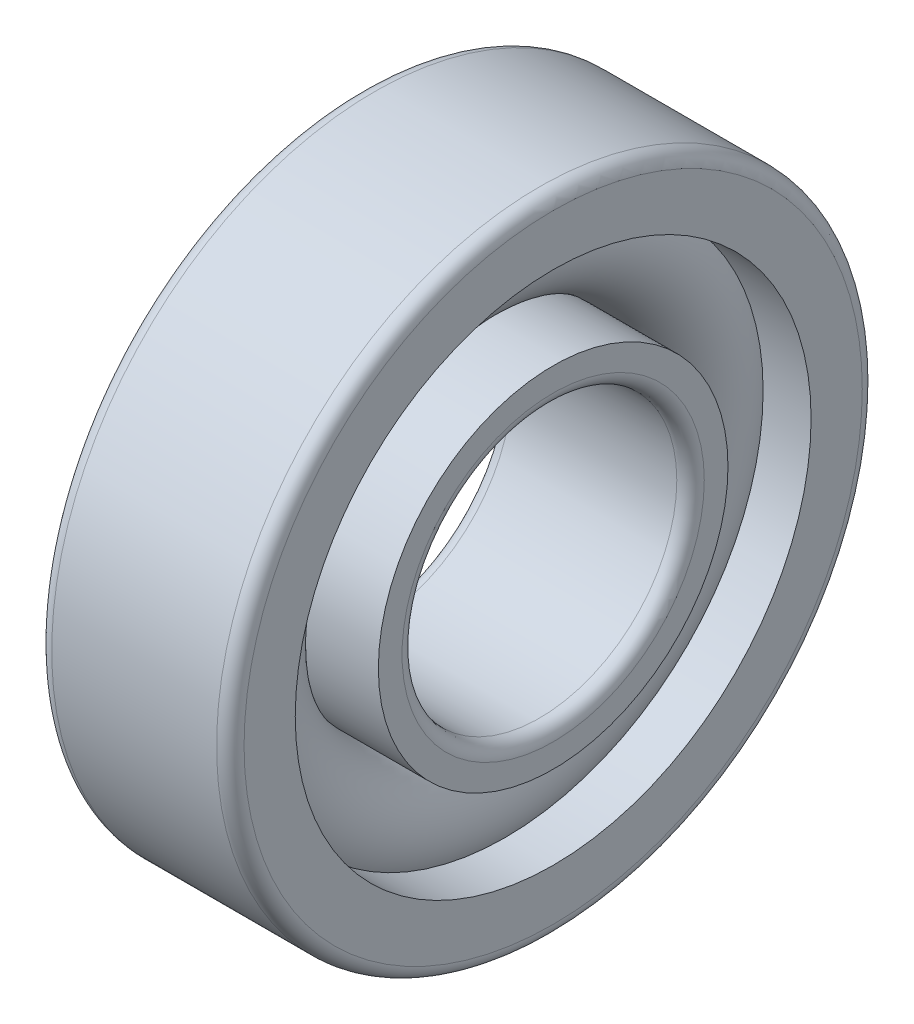
ISO-10303-21;
HEADER;
FILE_DESCRIPTION(('STEP AP214'),'2;1');
FILE_NAME('part.step','',(''),(''),'','','');
FILE_SCHEMA(('AUTOMOTIVE_DESIGN { 1 0 10303 214 1 1 1 1 }'));
ENDSEC;
DATA;
#1=APPLICATION_CONTEXT('core data for automotive mechanical design processes');
#2=APPLICATION_PROTOCOL_DEFINITION('international standard','automotive_design',2000,#1);
#3=PRODUCT_CONTEXT('',#1,'mechanical');
#4=PRODUCT('Part','Part','',(#3));
#5=PRODUCT_RELATED_PRODUCT_CATEGORY('part','',(#4));
#6=PRODUCT_DEFINITION_FORMATION('','',#4);
#7=PRODUCT_DEFINITION_CONTEXT('part definition',#1,'design');
#8=PRODUCT_DEFINITION('design','',#6,#7);
#9=PRODUCT_DEFINITION_SHAPE('','',#8);
#10=(LENGTH_UNIT() NAMED_UNIT(*) SI_UNIT(.MILLI.,.METRE.));
#11=(NAMED_UNIT(*) PLANE_ANGLE_UNIT() SI_UNIT($,.RADIAN.));
#12=(NAMED_UNIT(*) SI_UNIT($,.STERADIAN.) SOLID_ANGLE_UNIT());
#13=UNCERTAINTY_MEASURE_WITH_UNIT(LENGTH_MEASURE(1.E-05),#10,'distance_accuracy_value','');
#14=(GEOMETRIC_REPRESENTATION_CONTEXT(3) GLOBAL_UNCERTAINTY_ASSIGNED_CONTEXT((#13)) GLOBAL_UNIT_ASSIGNED_CONTEXT((#10,
#11,#12)) REPRESENTATION_CONTEXT('',''));
#15=CARTESIAN_POINT('',(0.,0.,0.));
#16=DIRECTION('',(0.,0.,1.));
#17=DIRECTION('',(1.,0.,0.));
#18=AXIS2_PLACEMENT_3D('',#15,#16,#17);
#19=CARTESIAN_POINT('',(0.,0.,0.));
#20=DIRECTION('',(-1.,0.,0.));
#21=DIRECTION('',(0.,0.,1.));
#22=AXIS2_PLACEMENT_3D('',#19,#20,#21);
#23=TOROIDAL_SURFACE('',#22,16.75,4.05);
#24=CARTESIAN_POINT('',(3.50740288532698,0.,0.));
#25=DIRECTION('',(-1.,0.,0.));
#26=DIRECTION('',(0.,0.,1.));
#27=AXIS2_PLACEMENT_3D('',#24,#25,#26);
#28=CIRCLE('',#27,18.775);
#29=CARTESIAN_POINT('',(3.50740288532698,0.,18.775));
#30=VERTEX_POINT('',#29);
#31=EDGE_CURVE('E35',#30,#30,#28,.F.);
#32=ORIENTED_EDGE('',*,*,#31,.T.);
#33=EDGE_LOOP('',(#32));
#34=FACE_BOUND('',#33,.T.);
#35=CARTESIAN_POINT('',(0.449305018890313,0.,0.));
#36=DIRECTION('',(-1.,0.,0.));
#37=DIRECTION('',(0.,0.,1.));
#38=AXIS2_PLACEMENT_3D('',#35,#36,#37);
#39=CIRCLE('',#38,12.725);
#40=CARTESIAN_POINT('',(0.449305018890313,0.,12.725));
#41=VERTEX_POINT('',#40);
#42=EDGE_CURVE('E10',#41,#41,#39,.T.);
#43=ORIENTED_EDGE('',*,*,#42,.T.);
#44=EDGE_LOOP('',(#43));
#45=FACE_BOUND('',#44,.T.);
#46=ADVANCED_FACE('F31',(#34,#45),#23,.T.);
#47=CARTESIAN_POINT('',(-20.6375,0.,0.));
#48=DIRECTION('',(1.,0.,0.));
#49=DIRECTION('',(0.,0.,-1.));
#50=AXIS2_PLACEMENT_3D('',#47,#48,#49);
#51=CYLINDRICAL_SURFACE('',#50,12.725);
#52=CARTESIAN_POINT('',(7.,0.,0.));
#53=DIRECTION('',(1.,0.,0.));
#54=DIRECTION('',(0.,0.,-1.));
#55=AXIS2_PLACEMENT_3D('',#52,#53,#54);
#56=CIRCLE('',#55,12.725);
#57=CARTESIAN_POINT('',(7.,0.,-12.725));
#58=VERTEX_POINT('',#57);
#59=EDGE_CURVE('E44',#58,#58,#56,.T.);
#60=ORIENTED_EDGE('',*,*,#59,.F.);
#61=EDGE_LOOP('',(#60));
#62=FACE_BOUND('',#61,.T.);
#63=ORIENTED_EDGE('',*,*,#42,.F.);
#64=EDGE_LOOP('',(#63));
#65=FACE_BOUND('',#64,.T.);
#66=ADVANCED_FACE('F83',(#62,#65),#51,.T.);
#67=CARTESIAN_POINT('',(-20.6375,0.,0.));
#68=DIRECTION('',(1.,0.,0.));
#69=DIRECTION('',(0.,0.,-1.));
#70=AXIS2_PLACEMENT_3D('',#67,#68,#69);
#71=CYLINDRICAL_SURFACE('',#70,14.725);
#72=CARTESIAN_POINT('',(-7.,0.,0.));
#73=DIRECTION('',(1.,0.,0.));
#74=DIRECTION('',(0.,0.,-1.));
#75=AXIS2_PLACEMENT_3D('',#72,#73,#74);
#76=CIRCLE('',#75,14.725);
#77=CARTESIAN_POINT('',(-7.,0.,-14.725));
#78=VERTEX_POINT('',#77);
#79=EDGE_CURVE('E53',#78,#78,#76,.T.);
#80=ORIENTED_EDGE('',*,*,#79,.T.);
#81=EDGE_LOOP('',(#80));
#82=FACE_BOUND('',#81,.T.);
#83=CARTESIAN_POINT('',(-3.50740288532698,0.,0.));
#84=DIRECTION('',(1.,0.,0.));
#85=DIRECTION('',(0.,0.,-1.));
#86=AXIS2_PLACEMENT_3D('',#83,#84,#85);
#87=CIRCLE('',#86,14.725);
#88=CARTESIAN_POINT('',(-3.50740288532698,0.,-14.725));
#89=VERTEX_POINT('',#88);
#90=EDGE_CURVE('E39',#89,#89,#87,.T.);
#91=ORIENTED_EDGE('',*,*,#90,.F.);
#92=EDGE_LOOP('',(#91));
#93=FACE_BOUND('',#92,.T.);
#94=ADVANCED_FACE('F86',(#82,#93),#71,.T.);
#95=CARTESIAN_POINT('',(7.,11.,0.));
#96=DIRECTION('',(1.,0.,0.));
#97=DIRECTION('',(0.,0.,-1.));
#98=AXIS2_PLACEMENT_3D('',#95,#96,#97);
#99=PLANE('',#98);
#100=ORIENTED_EDGE('',*,*,#59,.T.);
#101=EDGE_LOOP('',(#100));
#102=FACE_BOUND('',#101,.T.);
#103=CARTESIAN_POINT('',(7.,0.,0.));
#104=DIRECTION('',(1.,0.,0.));
#105=DIRECTION('',(0.,0.,-1.));
#106=AXIS2_PLACEMENT_3D('',#103,#104,#105);
#107=CIRCLE('',#106,11.);
#108=CARTESIAN_POINT('',(7.,0.,-11.));
#109=VERTEX_POINT('',#108);
#110=EDGE_CURVE('E75',#109,#109,#107,.T.);
#111=ORIENTED_EDGE('',*,*,#110,.F.);
#112=EDGE_LOOP('',(#111));
#113=FACE_BOUND('',#112,.T.);
#114=ADVANCED_FACE('F80',(#102,#113),#99,.T.);
#115=CARTESIAN_POINT('',(6.,0.,0.));
#116=DIRECTION('',(1.,0.,0.));
#117=DIRECTION('',(0.,0.,-1.));
#118=AXIS2_PLACEMENT_3D('',#115,#116,#117);
#119=TOROIDAL_SURFACE('',#118,11.,0.999999999999997);
#120=ORIENTED_EDGE('',*,*,#110,.T.);
#121=EDGE_LOOP('',(#120));
#122=FACE_BOUND('',#121,.T.);
#123=CARTESIAN_POINT('',(6.,0.,0.));
#124=DIRECTION('',(1.,0.,0.));
#125=DIRECTION('',(0.,0.,-1.));
#126=AXIS2_PLACEMENT_3D('',#123,#124,#125);
#127=CIRCLE('',#126,10.);
#128=CARTESIAN_POINT('',(6.,0.,-10.));
#129=VERTEX_POINT('',#128);
#130=EDGE_CURVE('E72',#129,#129,#127,.T.);
#131=ORIENTED_EDGE('',*,*,#130,.F.);
#132=EDGE_LOOP('',(#131));
#133=FACE_BOUND('',#132,.T.);
#134=ADVANCED_FACE('F97',(#122,#133),#119,.T.);
#135=CARTESIAN_POINT('',(-20.6375,0.,0.));
#136=DIRECTION('',(1.,0.,0.));
#137=DIRECTION('',(0.,0.,-1.));
#138=AXIS2_PLACEMENT_3D('',#135,#136,#137);
#139=CYLINDRICAL_SURFACE('',#138,10.);
#140=ORIENTED_EDGE('',*,*,#130,.T.);
#141=EDGE_LOOP('',(#140));
#142=FACE_BOUND('',#141,.T.);
#143=CARTESIAN_POINT('',(-6.,0.,0.));
#144=DIRECTION('',(1.,0.,0.));
#145=DIRECTION('',(0.,0.,-1.));
#146=AXIS2_PLACEMENT_3D('',#143,#144,#145);
#147=CIRCLE('',#146,10.);
#148=CARTESIAN_POINT('',(-6.,0.,-10.));
#149=VERTEX_POINT('',#148);
#150=EDGE_CURVE('E69',#149,#149,#147,.T.);
#151=ORIENTED_EDGE('',*,*,#150,.F.);
#152=EDGE_LOOP('',(#151));
#153=FACE_BOUND('',#152,.T.);
#154=ADVANCED_FACE('F100',(#142,#153),#139,.F.);
#155=CARTESIAN_POINT('',(-6.,0.,0.));
#156=DIRECTION('',(1.,0.,0.));
#157=DIRECTION('',(0.,0.,-1.));
#158=AXIS2_PLACEMENT_3D('',#155,#156,#157);
#159=TOROIDAL_SURFACE('',#158,11.,0.999999999999997);
#160=ORIENTED_EDGE('',*,*,#150,.T.);
#161=EDGE_LOOP('',(#160));
#162=FACE_BOUND('',#161,.T.);
#163=CARTESIAN_POINT('',(-7.,0.,0.));
#164=DIRECTION('',(1.,0.,0.));
#165=DIRECTION('',(0.,0.,-1.));
#166=AXIS2_PLACEMENT_3D('',#163,#164,#165);
#167=CIRCLE('',#166,11.);
#168=CARTESIAN_POINT('',(-7.,0.,-11.));
#169=VERTEX_POINT('',#168);
#170=EDGE_CURVE('E66',#169,#169,#167,.T.);
#171=ORIENTED_EDGE('',*,*,#170,.F.);
#172=EDGE_LOOP('',(#171));
#173=FACE_BOUND('',#172,.T.);
#174=ADVANCED_FACE('F104',(#162,#173),#159,.T.);
#175=CARTESIAN_POINT('',(-7.,14.725,0.));
#176=DIRECTION('',(-1.,0.,0.));
#177=DIRECTION('',(0.,0.,1.));
#178=AXIS2_PLACEMENT_3D('',#175,#176,#177);
#179=PLANE('',#178);
#180=ORIENTED_EDGE('',*,*,#170,.T.);
#181=EDGE_LOOP('',(#180));
#182=FACE_BOUND('',#181,.T.);
#183=ORIENTED_EDGE('',*,*,#79,.F.);
#184=EDGE_LOOP('',(#183));
#185=FACE_BOUND('',#184,.T.);
#186=ADVANCED_FACE('F108',(#182,#185),#179,.T.);
#187=CARTESIAN_POINT('',(-0.449305018890283,0.,0.));
#188=DIRECTION('',(1.,0.,0.));
#189=DIRECTION('',(0.,0.,-1.));
#190=AXIS2_PLACEMENT_3D('',#187,#188,#189);
#191=CIRCLE('',#190,20.775);
#192=CARTESIAN_POINT('',(-0.449305018890283,0.,-20.775));
#193=VERTEX_POINT('',#192);
#194=EDGE_CURVE('E47',#193,#193,#191,.F.);
#195=ORIENTED_EDGE('',*,*,#194,.T.);
#196=EDGE_LOOP('',(#195));
#197=FACE_BOUND('',#196,.T.);
#198=ORIENTED_EDGE('',*,*,#90,.T.);
#199=EDGE_LOOP('',(#198));
#200=FACE_BOUND('',#199,.T.);
#201=ADVANCED_FACE('F33',(#197,#200),#23,.T.);
#202=CARTESIAN_POINT('',(-20.6375,0.,0.));
#203=DIRECTION('',(1.,0.,0.));
#204=DIRECTION('',(0.,0.,-1.));
#205=AXIS2_PLACEMENT_3D('',#202,#203,#204);
#206=CYLINDRICAL_SURFACE('',#205,18.775);
#207=CARTESIAN_POINT('',(7.,0.,0.));
#208=DIRECTION('',(1.,0.,0.));
#209=DIRECTION('',(0.,0.,-1.));
#210=AXIS2_PLACEMENT_3D('',#207,#208,#209);
#211=CIRCLE('',#210,18.775);
#212=CARTESIAN_POINT('',(7.,0.,-18.775));
#213=VERTEX_POINT('',#212);
#214=EDGE_CURVE('E149',#213,#213,#211,.T.);
#215=ORIENTED_EDGE('',*,*,#214,.T.);
#216=EDGE_LOOP('',(#215));
#217=FACE_BOUND('',#216,.T.);
#218=ORIENTED_EDGE('',*,*,#31,.F.);
#219=EDGE_LOOP('',(#218));
#220=FACE_BOUND('',#219,.T.);
#221=ADVANCED_FACE('F130',(#217,#220),#206,.F.);
#222=CARTESIAN_POINT('',(-20.6375,0.,0.));
#223=DIRECTION('',(1.,0.,0.));
#224=DIRECTION('',(0.,0.,-1.));
#225=AXIS2_PLACEMENT_3D('',#222,#223,#224);
#226=CYLINDRICAL_SURFACE('',#225,20.775);
#227=CARTESIAN_POINT('',(-7.,0.,0.));
#228=DIRECTION('',(1.,0.,0.));
#229=DIRECTION('',(0.,0.,-1.));
#230=AXIS2_PLACEMENT_3D('',#227,#228,#229);
#231=CIRCLE('',#230,20.775);
#232=CARTESIAN_POINT('',(-7.,0.,-20.775));
#233=VERTEX_POINT('',#232);
#234=EDGE_CURVE('E144',#233,#233,#231,.T.);
#235=ORIENTED_EDGE('',*,*,#234,.F.);
#236=EDGE_LOOP('',(#235));
#237=FACE_BOUND('',#236,.T.);
#238=ORIENTED_EDGE('',*,*,#194,.F.);
#239=EDGE_LOOP('',(#238));
#240=FACE_BOUND('',#239,.T.);
#241=ADVANCED_FACE('F117',(#237,#240),#226,.F.);
#242=CARTESIAN_POINT('',(-6.,0.,0.));
#243=DIRECTION('',(1.,0.,0.));
#244=DIRECTION('',(0.,0.,-1.));
#245=AXIS2_PLACEMENT_3D('',#242,#243,#244);
#246=TOROIDAL_SURFACE('',#245,22.5,1.);
#247=CARTESIAN_POINT('',(-7.,0.,0.));
#248=DIRECTION('',(1.,0.,0.));
#249=DIRECTION('',(0.,0.,-1.));
#250=AXIS2_PLACEMENT_3D('',#247,#248,#249);
#251=CIRCLE('',#250,22.5);
#252=CARTESIAN_POINT('',(-7.,0.,-22.5));
#253=VERTEX_POINT('',#252);
#254=EDGE_CURVE('E147',#253,#253,#251,.T.);
#255=ORIENTED_EDGE('',*,*,#254,.T.);
#256=EDGE_LOOP('',(#255));
#257=FACE_BOUND('',#256,.T.);
#258=CARTESIAN_POINT('',(-6.,0.,0.));
#259=DIRECTION('',(1.,0.,0.));
#260=DIRECTION('',(0.,0.,-1.));
#261=AXIS2_PLACEMENT_3D('',#258,#259,#260);
#262=CIRCLE('',#261,23.5);
#263=CARTESIAN_POINT('',(-6.,0.,-23.5));
#264=VERTEX_POINT('',#263);
#265=EDGE_CURVE('E49',#264,#264,#262,.T.);
#266=ORIENTED_EDGE('',*,*,#265,.F.);
#267=EDGE_LOOP('',(#266));
#268=FACE_BOUND('',#267,.T.);
#269=ADVANCED_FACE('F113',(#257,#268),#246,.T.);
#270=CARTESIAN_POINT('',(-20.6375,0.,0.));
#271=DIRECTION('',(1.,0.,0.));
#272=DIRECTION('',(0.,0.,-1.));
#273=AXIS2_PLACEMENT_3D('',#270,#271,#272);
#274=CYLINDRICAL_SURFACE('',#273,23.5);
#275=ORIENTED_EDGE('',*,*,#265,.T.);
#276=EDGE_LOOP('',(#275));
#277=FACE_BOUND('',#276,.T.);
#278=CARTESIAN_POINT('',(6.,0.,0.));
#279=DIRECTION('',(1.,0.,0.));
#280=DIRECTION('',(0.,0.,-1.));
#281=AXIS2_PLACEMENT_3D('',#278,#279,#280);
#282=CIRCLE('',#281,23.5);
#283=CARTESIAN_POINT('',(6.,0.,-23.5));
#284=VERTEX_POINT('',#283);
#285=EDGE_CURVE('E55',#284,#284,#282,.T.);
#286=ORIENTED_EDGE('',*,*,#285,.F.);
#287=EDGE_LOOP('',(#286));
#288=FACE_BOUND('',#287,.T.);
#289=ADVANCED_FACE('F116',(#277,#288),#274,.T.);
#290=CARTESIAN_POINT('',(6.,0.,0.));
#291=DIRECTION('',(1.,0.,0.));
#292=DIRECTION('',(0.,0.,-1.));
#293=AXIS2_PLACEMENT_3D('',#290,#291,#292);
#294=TOROIDAL_SURFACE('',#293,22.5,1.);
#295=ORIENTED_EDGE('',*,*,#285,.T.);
#296=EDGE_LOOP('',(#295));
#297=FACE_BOUND('',#296,.T.);
#298=CARTESIAN_POINT('',(7.,0.,0.));
#299=DIRECTION('',(1.,0.,0.));
#300=DIRECTION('',(0.,0.,-1.));
#301=AXIS2_PLACEMENT_3D('',#298,#299,#300);
#302=CIRCLE('',#301,22.5);
#303=CARTESIAN_POINT('',(7.,0.,-22.5));
#304=VERTEX_POINT('',#303);
#305=EDGE_CURVE('E60',#304,#304,#302,.T.);
#306=ORIENTED_EDGE('',*,*,#305,.F.);
#307=EDGE_LOOP('',(#306));
#308=FACE_BOUND('',#307,.T.);
#309=ADVANCED_FACE('F121',(#297,#308),#294,.T.);
#310=CARTESIAN_POINT('',(7.,22.5,0.));
#311=DIRECTION('',(1.,0.,0.));
#312=DIRECTION('',(0.,0.,-1.));
#313=AXIS2_PLACEMENT_3D('',#310,#311,#312);
#314=PLANE('',#313);
#315=ORIENTED_EDGE('',*,*,#305,.T.);
#316=EDGE_LOOP('',(#315));
#317=FACE_BOUND('',#316,.T.);
#318=ORIENTED_EDGE('',*,*,#214,.F.);
#319=EDGE_LOOP('',(#318));
#320=FACE_BOUND('',#319,.T.);
#321=ADVANCED_FACE('F124',(#317,#320),#314,.T.);
#322=CARTESIAN_POINT('',(-7.,20.775,0.));
#323=DIRECTION('',(-1.,0.,0.));
#324=DIRECTION('',(0.,0.,1.));
#325=AXIS2_PLACEMENT_3D('',#322,#323,#324);
#326=PLANE('',#325);
#327=ORIENTED_EDGE('',*,*,#234,.T.);
#328=EDGE_LOOP('',(#327));
#329=FACE_BOUND('',#328,.T.);
#330=ORIENTED_EDGE('',*,*,#254,.F.);
#331=EDGE_LOOP('',(#330));
#332=FACE_BOUND('',#331,.T.);
#333=ADVANCED_FACE('F128',(#329,#332),#326,.T.);
#334=CLOSED_SHELL('',(#46,#66,#94,#114,#134,#154,#174,#186,#201,#221,#241,#269,#289,#309,#321,#333));
#335=MANIFOLD_SOLID_BREP('B2',#334);
#336=ADVANCED_BREP_SHAPE_REPRESENTATION('',(#18,#335),#14);
#337=SHAPE_DEFINITION_REPRESENTATION(#9,#336);
ENDSEC;
END-ISO-10303-21;
